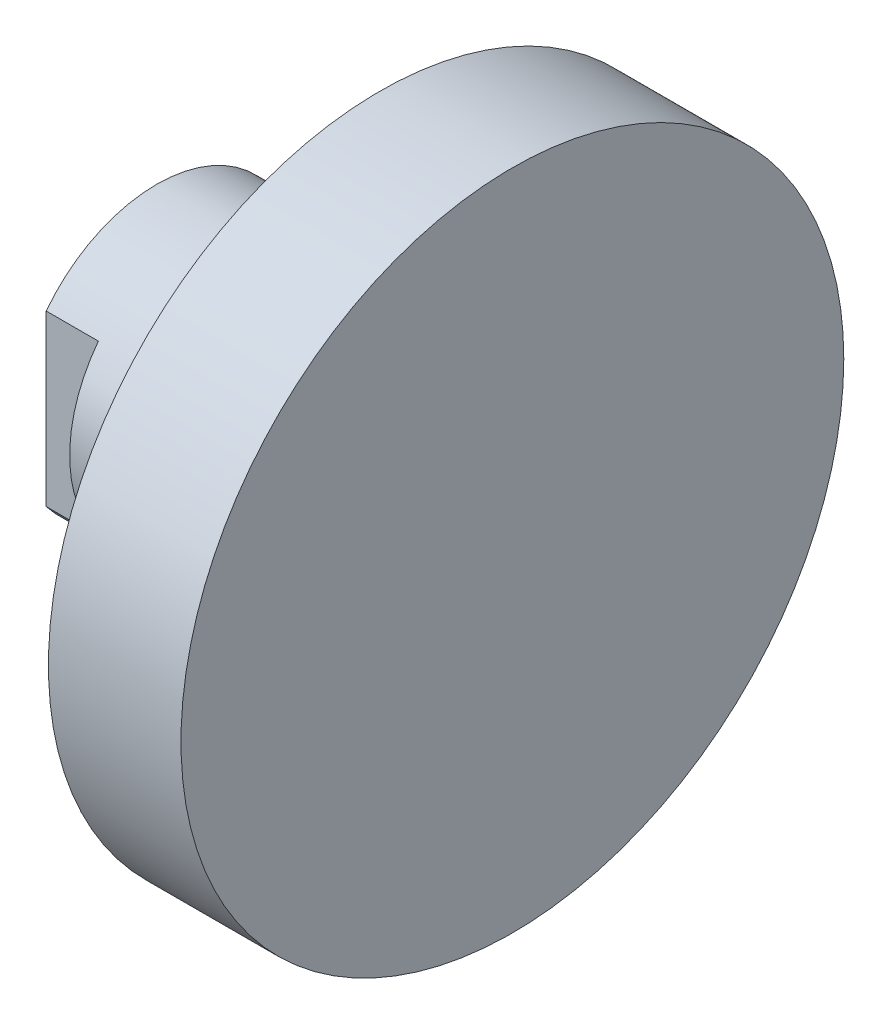
ISO-10303-21;
HEADER;
FILE_DESCRIPTION(('STEP AP214'),'2;1');
FILE_NAME('part.step','',(''),(''),'','','');
FILE_SCHEMA(('AUTOMOTIVE_DESIGN { 1 0 10303 214 1 1 1 1 }'));
ENDSEC;
DATA;
#1=APPLICATION_CONTEXT('core data for automotive mechanical design processes');
#2=APPLICATION_PROTOCOL_DEFINITION('international standard','automotive_design',2000,#1);
#3=PRODUCT_CONTEXT('',#1,'mechanical');
#4=PRODUCT('Part','Part','',(#3));
#5=PRODUCT_RELATED_PRODUCT_CATEGORY('part','',(#4));
#6=PRODUCT_DEFINITION_FORMATION('','',#4);
#7=PRODUCT_DEFINITION_CONTEXT('part definition',#1,'design');
#8=PRODUCT_DEFINITION('design','',#6,#7);
#9=PRODUCT_DEFINITION_SHAPE('','',#8);
#10=(LENGTH_UNIT() NAMED_UNIT(*) SI_UNIT(.MILLI.,.METRE.));
#11=(NAMED_UNIT(*) PLANE_ANGLE_UNIT() SI_UNIT($,.RADIAN.));
#12=(NAMED_UNIT(*) SI_UNIT($,.STERADIAN.) SOLID_ANGLE_UNIT());
#13=UNCERTAINTY_MEASURE_WITH_UNIT(LENGTH_MEASURE(1.E-05),#10,'distance_accuracy_value','');
#14=(GEOMETRIC_REPRESENTATION_CONTEXT(3) GLOBAL_UNCERTAINTY_ASSIGNED_CONTEXT((#13)) GLOBAL_UNIT_ASSIGNED_CONTEXT((#10,
#11,#12)) REPRESENTATION_CONTEXT('',''));
#15=CARTESIAN_POINT('',(0.,0.,0.));
#16=DIRECTION('',(0.,0.,1.));
#17=DIRECTION('',(1.,0.,0.));
#18=AXIS2_PLACEMENT_3D('',#15,#16,#17);
#19=CARTESIAN_POINT('',(11.8169417433318,0.,0.));
#20=DIRECTION('',(-1.,0.,0.));
#21=DIRECTION('',(0.,0.,1.));
#22=AXIS2_PLACEMENT_3D('',#19,#20,#21);
#23=CONICAL_SURFACE('',#22,0.,1.0471975511966);
#24=CARTESIAN_POINT('',(9.398,0.,0.));
#25=DIRECTION('',(1.,0.,0.));
#26=DIRECTION('',(0.,0.,-1.));
#27=AXIS2_PLACEMENT_3D('',#24,#25,#26);
#28=CIRCLE('',#27,4.18973);
#29=CARTESIAN_POINT('',(9.398,0.,-4.18973));
#30=VERTEX_POINT('',#29);
#31=EDGE_CURVE('E90',#30,#30,#28,.T.);
#32=ORIENTED_EDGE('',*,*,#31,.F.);
#33=EDGE_LOOP('',(#32));
#34=FACE_BOUND('',#33,.T.);
#35=CARTESIAN_POINT('',(11.8169417433318,0.,0.));
#36=VERTEX_POINT('',#35);
#37=VERTEX_LOOP('',#36);
#38=FACE_BOUND('',#37,.T.);
#39=ADVANCED_FACE('F16',(#34,#38),#23,.F.);
#40=CARTESIAN_POINT('',(17.145,0.,0.));
#41=DIRECTION('',(1.,0.,0.));
#42=DIRECTION('',(0.,0.,-1.));
#43=AXIS2_PLACEMENT_3D('',#40,#41,#42);
#44=CYLINDRICAL_SURFACE('',#43,4.18973);
#45=CARTESIAN_POINT('',(-2.72923,0.,0.));
#46=DIRECTION('',(1.,0.,0.));
#47=DIRECTION('',(0.,0.,-1.));
#48=AXIS2_PLACEMENT_3D('',#45,#46,#47);
#49=CIRCLE('',#48,4.18973);
#50=CARTESIAN_POINT('',(-2.72923,0.,-4.18973));
#51=VERTEX_POINT('',#50);
#52=EDGE_CURVE('E82',#51,#51,#49,.T.);
#53=ORIENTED_EDGE('',*,*,#52,.F.);
#54=EDGE_LOOP('',(#53));
#55=FACE_BOUND('',#54,.T.);
#56=ORIENTED_EDGE('',*,*,#31,.T.);
#57=EDGE_LOOP('',(#56));
#58=FACE_BOUND('',#57,.T.);
#59=ADVANCED_FACE('F121',(#55,#58),#44,.F.);
#60=CARTESIAN_POINT('',(-2.72923,0.,0.));
#61=DIRECTION('',(-1.,0.,0.));
#62=DIRECTION('',(0.,0.,1.));
#63=AXIS2_PLACEMENT_3D('',#60,#61,#62);
#64=CONICAL_SURFACE('',#63,4.18973,0.785398163397448);
#65=CARTESIAN_POINT('',(-3.302,0.,0.));
#66=DIRECTION('',(1.,0.,0.));
#67=DIRECTION('',(0.,0.,-1.));
#68=AXIS2_PLACEMENT_3D('',#65,#66,#67);
#69=CIRCLE('',#68,4.7625);
#70=CARTESIAN_POINT('',(-3.302,0.,-4.7625));
#71=VERTEX_POINT('',#70);
#72=EDGE_CURVE('E79',#71,#71,#69,.T.);
#73=ORIENTED_EDGE('',*,*,#72,.F.);
#74=EDGE_LOOP('',(#73));
#75=FACE_BOUND('',#74,.T.);
#76=ORIENTED_EDGE('',*,*,#52,.T.);
#77=EDGE_LOOP('',(#76));
#78=FACE_BOUND('',#77,.T.);
#79=ADVANCED_FACE('F126',(#75,#78),#64,.F.);
#80=CARTESIAN_POINT('',(-3.302,0.,-4.7625));
#81=DIRECTION('',(1.,0.,0.));
#82=DIRECTION('',(0.,0.,-1.));
#83=AXIS2_PLACEMENT_3D('',#80,#81,#82);
#84=PLANE('',#83);
#85=DIRECTION('',(0.,1.,0.));
#86=VECTOR('',#85,1.);
#87=CARTESIAN_POINT('',(-3.302,-8.001,-6.35));
#88=LINE('',#87,#86);
#89=CARTESIAN_POINT('',(-3.302,-4.86759704577115,-6.35));
#90=VERTEX_POINT('',#89);
#91=CARTESIAN_POINT('',(-3.302,4.86759704577115,-6.35));
#92=VERTEX_POINT('',#91);
#93=EDGE_CURVE('E74',#90,#92,#88,.T.);
#94=ORIENTED_EDGE('',*,*,#93,.F.);
#95=CARTESIAN_POINT('',(-3.302,0.,0.));
#96=DIRECTION('',(1.,0.,0.));
#97=DIRECTION('',(0.,0.,-1.));
#98=AXIS2_PLACEMENT_3D('',#95,#96,#97);
#99=CIRCLE('',#98,8.001);
#100=CARTESIAN_POINT('',(-3.302,-4.86759704577115,6.35));
#101=VERTEX_POINT('',#100);
#102=EDGE_CURVE('E73',#101,#90,#99,.T.);
#103=ORIENTED_EDGE('',*,*,#102,.F.);
#104=DIRECTION('',(0.,-1.,0.));
#105=VECTOR('',#104,1.);
#106=CARTESIAN_POINT('',(-3.302,8.001,6.35));
#107=LINE('',#106,#105);
#108=CARTESIAN_POINT('',(-3.302,4.86759704577115,6.35));
#109=VERTEX_POINT('',#108);
#110=EDGE_CURVE('E58',#109,#101,#107,.T.);
#111=ORIENTED_EDGE('',*,*,#110,.F.);
#112=EDGE_CURVE('E71',#92,#109,#99,.T.);
#113=ORIENTED_EDGE('',*,*,#112,.F.);
#114=EDGE_LOOP('',(#94,#103,#111,#113));
#115=FACE_BOUND('',#114,.T.);
#116=ORIENTED_EDGE('',*,*,#72,.T.);
#117=EDGE_LOOP('',(#116));
#118=FACE_BOUND('',#117,.T.);
#119=ADVANCED_FACE('F69',(#115,#118),#84,.F.);
#120=CARTESIAN_POINT('',(17.145,0.,0.));
#121=DIRECTION('',(1.,0.,0.));
#122=DIRECTION('',(0.,0.,-1.));
#123=AXIS2_PLACEMENT_3D('',#120,#121,#122);
#124=CYLINDRICAL_SURFACE('',#123,8.001);
#125=CARTESIAN_POINT('',(9.525,0.,0.));
#126=DIRECTION('',(1.,0.,0.));
#127=DIRECTION('',(0.,0.,-1.));
#128=AXIS2_PLACEMENT_3D('',#125,#126,#127);
#129=CIRCLE('',#128,8.001);
#130=CARTESIAN_POINT('',(9.525,0.,-8.001));
#131=VERTEX_POINT('',#130);
#132=EDGE_CURVE('E84',#131,#131,#129,.T.);
#133=ORIENTED_EDGE('',*,*,#132,.F.);
#134=EDGE_LOOP('',(#133));
#135=FACE_BOUND('',#134,.T.);
#136=ORIENTED_EDGE('',*,*,#102,.T.);
#137=DIRECTION('',(1.,0.,0.));
#138=VECTOR('',#137,1.);
#139=CARTESIAN_POINT('',(17.145,-4.86759704577115,-6.35));
#140=LINE('',#139,#138);
#141=CARTESIAN_POINT('',(-0.302,-4.86759704577115,-6.35));
#142=VERTEX_POINT('',#141);
#143=EDGE_CURVE('E11',#90,#142,#140,.T.);
#144=ORIENTED_EDGE('',*,*,#143,.T.);
#145=CARTESIAN_POINT('',(-0.302,0.,0.));
#146=DIRECTION('',(-1.,0.,0.));
#147=DIRECTION('',(0.,0.,1.));
#148=AXIS2_PLACEMENT_3D('',#145,#146,#147);
#149=CIRCLE('',#148,8.001);
#150=CARTESIAN_POINT('',(-0.302,4.86759704577115,-6.35));
#151=VERTEX_POINT('',#150);
#152=EDGE_CURVE('E63',#151,#142,#149,.T.);
#153=ORIENTED_EDGE('',*,*,#152,.F.);
#154=DIRECTION('',(1.,0.,0.));
#155=VECTOR('',#154,1.);
#156=CARTESIAN_POINT('',(17.145,4.86759704577115,-6.35));
#157=LINE('',#156,#155);
#158=EDGE_CURVE('E23',#151,#92,#157,.F.);
#159=ORIENTED_EDGE('',*,*,#158,.T.);
#160=ORIENTED_EDGE('',*,*,#112,.T.);
#161=DIRECTION('',(1.,0.,0.));
#162=VECTOR('',#161,1.);
#163=CARTESIAN_POINT('',(17.145,4.86759704577115,6.35));
#164=LINE('',#163,#162);
#165=CARTESIAN_POINT('',(-0.302,4.86759704577115,6.35));
#166=VERTEX_POINT('',#165);
#167=EDGE_CURVE('E55',#109,#166,#164,.T.);
#168=ORIENTED_EDGE('',*,*,#167,.T.);
#169=CARTESIAN_POINT('',(-0.302,-4.86759704577115,6.35));
#170=VERTEX_POINT('',#169);
#171=EDGE_CURVE('E93',#170,#166,#149,.T.);
#172=ORIENTED_EDGE('',*,*,#171,.F.);
#173=DIRECTION('',(1.,0.,0.));
#174=VECTOR('',#173,1.);
#175=CARTESIAN_POINT('',(17.145,-4.86759704577115,6.35));
#176=LINE('',#175,#174);
#177=EDGE_CURVE('E64',#170,#101,#176,.F.);
#178=ORIENTED_EDGE('',*,*,#177,.T.);
#179=EDGE_LOOP('',(#136,#144,#153,#159,#160,#168,#172,#178));
#180=FACE_BOUND('',#179,.T.);
#181=ADVANCED_FACE('F77',(#135,#180),#124,.T.);
#182=CARTESIAN_POINT('',(9.525,0.,-8.001));
#183=DIRECTION('',(1.,0.,0.));
#184=DIRECTION('',(0.,0.,-1.));
#185=AXIS2_PLACEMENT_3D('',#182,#183,#184);
#186=PLANE('',#185);
#187=CARTESIAN_POINT('',(9.525,0.,0.));
#188=DIRECTION('',(1.,0.,0.));
#189=DIRECTION('',(0.,0.,-1.));
#190=AXIS2_PLACEMENT_3D('',#187,#188,#189);
#191=CIRCLE('',#190,19.05);
#192=CARTESIAN_POINT('',(9.525,0.,-19.05));
#193=VERTEX_POINT('',#192);
#194=EDGE_CURVE('E227',#193,#193,#191,.T.);
#195=ORIENTED_EDGE('',*,*,#194,.F.);
#196=EDGE_LOOP('',(#195));
#197=FACE_BOUND('',#196,.T.);
#198=ORIENTED_EDGE('',*,*,#132,.T.);
#199=EDGE_LOOP('',(#198));
#200=FACE_BOUND('',#199,.T.);
#201=ADVANCED_FACE('F141',(#197,#200),#186,.F.);
#202=CARTESIAN_POINT('',(17.145,0.,0.));
#203=DIRECTION('',(1.,0.,0.));
#204=DIRECTION('',(0.,0.,-1.));
#205=AXIS2_PLACEMENT_3D('',#202,#203,#204);
#206=CYLINDRICAL_SURFACE('',#205,19.05);
#207=CARTESIAN_POINT('',(17.145,0.,0.));
#208=DIRECTION('',(1.,0.,0.));
#209=DIRECTION('',(0.,0.,-1.));
#210=AXIS2_PLACEMENT_3D('',#207,#208,#209);
#211=CIRCLE('',#210,19.05);
#212=CARTESIAN_POINT('',(17.145,0.,-19.05));
#213=VERTEX_POINT('',#212);
#214=EDGE_CURVE('E103',#213,#213,#211,.T.);
#215=ORIENTED_EDGE('',*,*,#214,.F.);
#216=EDGE_LOOP('',(#215));
#217=FACE_BOUND('',#216,.T.);
#218=ORIENTED_EDGE('',*,*,#194,.T.);
#219=EDGE_LOOP('',(#218));
#220=FACE_BOUND('',#219,.T.);
#221=ADVANCED_FACE('F115',(#217,#220),#206,.T.);
#222=CARTESIAN_POINT('',(17.145,0.,-19.05));
#223=DIRECTION('',(-1.,0.,0.));
#224=DIRECTION('',(0.,0.,1.));
#225=AXIS2_PLACEMENT_3D('',#222,#223,#224);
#226=PLANE('',#225);
#227=ORIENTED_EDGE('',*,*,#214,.T.);
#228=EDGE_LOOP('',(#227));
#229=FACE_BOUND('',#228,.T.);
#230=ADVANCED_FACE('F107',(#229),#226,.F.);
#231=CARTESIAN_POINT('',(-0.302,0.,0.));
#232=DIRECTION('',(-1.,0.,0.));
#233=DIRECTION('',(0.,0.,1.));
#234=AXIS2_PLACEMENT_3D('',#231,#232,#233);
#235=PLANE('',#234);
#236=ORIENTED_EDGE('',*,*,#171,.T.);
#237=DIRECTION('',(0.,-1.,0.));
#238=VECTOR('',#237,1.);
#239=CARTESIAN_POINT('',(-0.302,8.001,6.35));
#240=LINE('',#239,#238);
#241=EDGE_CURVE('E29',#166,#170,#240,.T.);
#242=ORIENTED_EDGE('',*,*,#241,.T.);
#243=EDGE_LOOP('',(#236,#242));
#244=FACE_BOUND('',#243,.T.);
#245=ADVANCED_FACE('F105',(#244),#235,.T.);
#246=CARTESIAN_POINT('',(-0.302,8.001,6.35));
#247=DIRECTION('',(0.,0.,-1.));
#248=DIRECTION('',(-1.,0.,0.));
#249=AXIS2_PLACEMENT_3D('',#246,#247,#248);
#250=PLANE('',#249);
#251=ORIENTED_EDGE('',*,*,#110,.T.);
#252=ORIENTED_EDGE('',*,*,#177,.F.);
#253=ORIENTED_EDGE('',*,*,#241,.F.);
#254=ORIENTED_EDGE('',*,*,#167,.F.);
#255=EDGE_LOOP('',(#251,#252,#253,#254));
#256=FACE_BOUND('',#255,.T.);
#257=ADVANCED_FACE('F57',(#256),#250,.F.);
#258=CARTESIAN_POINT('',(-0.302,-8.001,-6.35));
#259=DIRECTION('',(0.,0.,1.));
#260=DIRECTION('',(1.,0.,0.));
#261=AXIS2_PLACEMENT_3D('',#258,#259,#260);
#262=PLANE('',#261);
#263=ORIENTED_EDGE('',*,*,#143,.F.);
#264=ORIENTED_EDGE('',*,*,#93,.T.);
#265=ORIENTED_EDGE('',*,*,#158,.F.);
#266=DIRECTION('',(0.,1.,0.));
#267=VECTOR('',#266,1.);
#268=CARTESIAN_POINT('',(-0.302,-8.001,-6.35));
#269=LINE('',#268,#267);
#270=EDGE_CURVE('E99',#142,#151,#269,.T.);
#271=ORIENTED_EDGE('',*,*,#270,.F.);
#272=EDGE_LOOP('',(#263,#264,#265,#271));
#273=FACE_BOUND('',#272,.T.);
#274=ADVANCED_FACE('F102',(#273),#262,.F.);
#275=ORIENTED_EDGE('',*,*,#270,.T.);
#276=ORIENTED_EDGE('',*,*,#152,.T.);
#277=EDGE_LOOP('',(#275,#276));
#278=FACE_BOUND('',#277,.T.);
#279=ADVANCED_FACE('F98',(#278),#235,.T.);
#280=CLOSED_SHELL('',(#39,#59,#79,#119,#181,#201,#221,#230,#245,#257,#274,#279));
#281=MANIFOLD_SOLID_BREP('B1',#280);
#282=ADVANCED_BREP_SHAPE_REPRESENTATION('',(#18,#281),#14);
#283=SHAPE_DEFINITION_REPRESENTATION(#9,#282);
ENDSEC;
END-ISO-10303-21;
